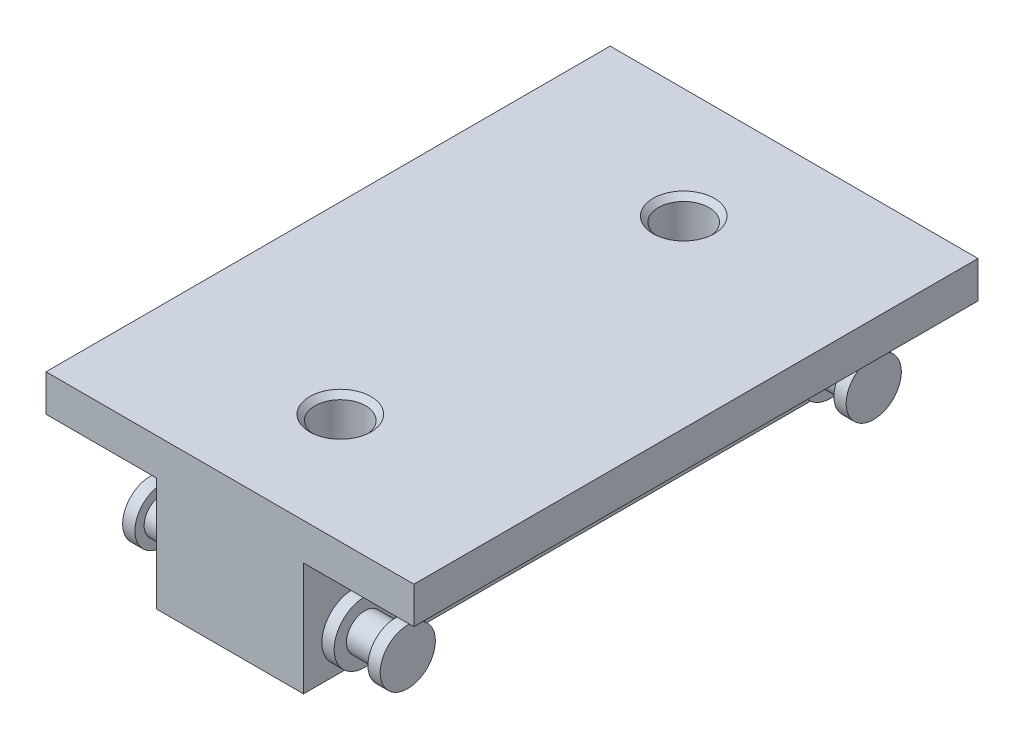
ISO-10303-21;
HEADER;
FILE_DESCRIPTION(('STEP AP214'),'2;1');
FILE_NAME('part.step','',(''),(''),'','','');
FILE_SCHEMA(('AUTOMOTIVE_DESIGN { 1 0 10303 214 1 1 1 1 }'));
ENDSEC;
DATA;
#1=APPLICATION_CONTEXT('core data for automotive mechanical design processes');
#2=APPLICATION_PROTOCOL_DEFINITION('international standard','automotive_design',2000,#1);
#3=PRODUCT_CONTEXT('',#1,'mechanical');
#4=PRODUCT('Part','Part','',(#3));
#5=PRODUCT_RELATED_PRODUCT_CATEGORY('part','',(#4));
#6=PRODUCT_DEFINITION_FORMATION('','',#4);
#7=PRODUCT_DEFINITION_CONTEXT('part definition',#1,'design');
#8=PRODUCT_DEFINITION('design','',#6,#7);
#9=PRODUCT_DEFINITION_SHAPE('','',#8);
#10=(LENGTH_UNIT() NAMED_UNIT(*) SI_UNIT(.MILLI.,.METRE.));
#11=(NAMED_UNIT(*) PLANE_ANGLE_UNIT() SI_UNIT($,.RADIAN.));
#12=(NAMED_UNIT(*) SI_UNIT($,.STERADIAN.) SOLID_ANGLE_UNIT());
#13=UNCERTAINTY_MEASURE_WITH_UNIT(LENGTH_MEASURE(1.E-05),#10,'distance_accuracy_value','');
#14=(GEOMETRIC_REPRESENTATION_CONTEXT(3) GLOBAL_UNCERTAINTY_ASSIGNED_CONTEXT((#13)) GLOBAL_UNIT_ASSIGNED_CONTEXT((#10,
#11,#12)) REPRESENTATION_CONTEXT('',''));
#15=CARTESIAN_POINT('',(0.,0.,0.));
#16=DIRECTION('',(0.,0.,1.));
#17=DIRECTION('',(1.,0.,0.));
#18=AXIS2_PLACEMENT_3D('',#15,#16,#17);
#19=CARTESIAN_POINT('',(15.,6.25,23.));
#20=DIRECTION('',(0.,-1.,0.));
#21=DIRECTION('',(0.,0.,-1.));
#22=AXIS2_PLACEMENT_3D('',#19,#20,#21);
#23=PLANE('',#22);
#24=CARTESIAN_POINT('',(0.,6.25,14.));
#25=DIRECTION('',(0.,1.,0.));
#26=DIRECTION('',(0.,0.,1.));
#27=AXIS2_PLACEMENT_3D('',#24,#25,#26);
#28=CIRCLE('',#27,2.5);
#29=CARTESIAN_POINT('',(0.,6.25,16.5));
#30=VERTEX_POINT('',#29);
#31=EDGE_CURVE('E204',#30,#30,#28,.T.);
#32=ORIENTED_EDGE('',*,*,#31,.F.);
#33=EDGE_LOOP('',(#32));
#34=FACE_BOUND('',#33,.T.);
#35=DIRECTION('',(0.,0.,-1.));
#36=VECTOR('',#35,1.);
#37=CARTESIAN_POINT('',(15.,6.25,23.));
#38=LINE('',#37,#36);
#39=CARTESIAN_POINT('',(15.,6.25,23.));
#40=VERTEX_POINT('',#39);
#41=CARTESIAN_POINT('',(15.,6.25,-23.));
#42=VERTEX_POINT('',#41);
#43=EDGE_CURVE('E123',#40,#42,#38,.T.);
#44=ORIENTED_EDGE('',*,*,#43,.T.);
#45=DIRECTION('',(-1.,0.,0.));
#46=VECTOR('',#45,1.);
#47=CARTESIAN_POINT('',(15.,6.25,-23.));
#48=LINE('',#47,#46);
#49=CARTESIAN_POINT('',(-15.,6.25,-23.));
#50=VERTEX_POINT('',#49);
#51=EDGE_CURVE('E116',#42,#50,#48,.T.);
#52=ORIENTED_EDGE('',*,*,#51,.T.);
#53=DIRECTION('',(0.,0.,-1.));
#54=VECTOR('',#53,1.);
#55=CARTESIAN_POINT('',(-15.,6.25,23.));
#56=LINE('',#55,#54);
#57=CARTESIAN_POINT('',(-15.,6.25,23.));
#58=VERTEX_POINT('',#57);
#59=EDGE_CURVE('E99',#58,#50,#56,.T.);
#60=ORIENTED_EDGE('',*,*,#59,.F.);
#61=DIRECTION('',(-1.,0.,0.));
#62=VECTOR('',#61,1.);
#63=CARTESIAN_POINT('',(15.,6.25,23.));
#64=LINE('',#63,#62);
#65=EDGE_CURVE('E146',#40,#58,#64,.T.);
#66=ORIENTED_EDGE('',*,*,#65,.F.);
#67=EDGE_LOOP('',(#44,#52,#60,#66));
#68=FACE_BOUND('',#67,.T.);
#69=CARTESIAN_POINT('',(0.,6.25,-14.));
#70=DIRECTION('',(0.,1.,0.));
#71=DIRECTION('',(0.,0.,1.));
#72=AXIS2_PLACEMENT_3D('',#69,#70,#71);
#73=CIRCLE('',#72,2.5);
#74=CARTESIAN_POINT('',(0.,6.25,-11.5));
#75=VERTEX_POINT('',#74);
#76=EDGE_CURVE('E586',#75,#75,#73,.T.);
#77=ORIENTED_EDGE('',*,*,#76,.F.);
#78=EDGE_LOOP('',(#77));
#79=FACE_BOUND('',#78,.T.);
#80=ADVANCED_FACE('F35',(#34,#68,#79),#23,.F.);
#81=CARTESIAN_POINT('',(-6.,-6.,23.));
#82=DIRECTION('',(0.,1.,0.));
#83=DIRECTION('',(0.,0.,1.));
#84=AXIS2_PLACEMENT_3D('',#81,#82,#83);
#85=PLANE('',#84);
#86=CARTESIAN_POINT('',(0.,-6.,14.));
#87=DIRECTION('',(0.,1.,0.));
#88=DIRECTION('',(0.,0.,1.));
#89=AXIS2_PLACEMENT_3D('',#86,#87,#88);
#90=CIRCLE('',#89,2.5);
#91=CARTESIAN_POINT('',(0.,-6.,16.5));
#92=VERTEX_POINT('',#91);
#93=EDGE_CURVE('E589',#92,#92,#90,.T.);
#94=ORIENTED_EDGE('',*,*,#93,.T.);
#95=EDGE_LOOP('',(#94));
#96=FACE_BOUND('',#95,.T.);
#97=DIRECTION('',(0.,0.,-1.));
#98=VECTOR('',#97,1.);
#99=CARTESIAN_POINT('',(-6.,-6.,23.));
#100=LINE('',#99,#98);
#101=CARTESIAN_POINT('',(-6.,-6.,23.));
#102=VERTEX_POINT('',#101);
#103=CARTESIAN_POINT('',(-6.,-6.,-23.));
#104=VERTEX_POINT('',#103);
#105=EDGE_CURVE('E166',#102,#104,#100,.T.);
#106=ORIENTED_EDGE('',*,*,#105,.T.);
#107=DIRECTION('',(1.,0.,0.));
#108=VECTOR('',#107,1.);
#109=CARTESIAN_POINT('',(-6.,-6.,-23.));
#110=LINE('',#109,#108);
#111=CARTESIAN_POINT('',(6.,-6.,-23.));
#112=VERTEX_POINT('',#111);
#113=EDGE_CURVE('E135',#104,#112,#110,.T.);
#114=ORIENTED_EDGE('',*,*,#113,.T.);
#115=DIRECTION('',(0.,0.,-1.));
#116=VECTOR('',#115,1.);
#117=CARTESIAN_POINT('',(6.,-6.,23.));
#118=LINE('',#117,#116);
#119=CARTESIAN_POINT('',(6.,-6.,23.));
#120=VERTEX_POINT('',#119);
#121=EDGE_CURVE('E164',#120,#112,#118,.T.);
#122=ORIENTED_EDGE('',*,*,#121,.F.);
#123=DIRECTION('',(1.,0.,0.));
#124=VECTOR('',#123,1.);
#125=CARTESIAN_POINT('',(-6.,-6.,23.));
#126=LINE('',#125,#124);
#127=EDGE_CURVE('E153',#102,#120,#126,.T.);
#128=ORIENTED_EDGE('',*,*,#127,.F.);
#129=EDGE_LOOP('',(#106,#114,#122,#128));
#130=FACE_BOUND('',#129,.T.);
#131=CARTESIAN_POINT('',(0.,-6.,-14.));
#132=DIRECTION('',(0.,1.,0.));
#133=DIRECTION('',(0.,0.,1.));
#134=AXIS2_PLACEMENT_3D('',#131,#132,#133);
#135=CIRCLE('',#134,2.5);
#136=CARTESIAN_POINT('',(0.,-6.,-11.5));
#137=VERTEX_POINT('',#136);
#138=EDGE_CURVE('E579',#137,#137,#135,.T.);
#139=ORIENTED_EDGE('',*,*,#138,.T.);
#140=EDGE_LOOP('',(#139));
#141=FACE_BOUND('',#140,.T.);
#142=ADVANCED_FACE('F190',(#96,#130,#141),#85,.F.);
#143=CARTESIAN_POINT('',(-6.,3.25,23.));
#144=DIRECTION('',(1.,0.,0.));
#145=DIRECTION('',(0.,0.,-1.));
#146=AXIS2_PLACEMENT_3D('',#143,#144,#145);
#147=PLANE('',#146);
#148=CARTESIAN_POINT('',(-6.,-3.125,19.));
#149=DIRECTION('',(1.,0.,0.));
#150=DIRECTION('',(0.,0.,-1.));
#151=AXIS2_PLACEMENT_3D('',#148,#149,#150);
#152=CIRCLE('',#151,2.5);
#153=CARTESIAN_POINT('',(-6.,-3.125,16.5));
#154=VERTEX_POINT('',#153);
#155=EDGE_CURVE('E173',#154,#154,#152,.F.);
#156=ORIENTED_EDGE('',*,*,#155,.F.);
#157=EDGE_LOOP('',(#156));
#158=FACE_BOUND('',#157,.T.);
#159=DIRECTION('',(0.,0.,-1.));
#160=VECTOR('',#159,1.);
#161=CARTESIAN_POINT('',(-6.,3.25,23.));
#162=LINE('',#161,#160);
#163=CARTESIAN_POINT('',(-6.,3.25,23.));
#164=VERTEX_POINT('',#163);
#165=CARTESIAN_POINT('',(-6.,3.25,-23.));
#166=VERTEX_POINT('',#165);
#167=EDGE_CURVE('E168',#164,#166,#162,.T.);
#168=ORIENTED_EDGE('',*,*,#167,.T.);
#169=DIRECTION('',(0.,-1.,0.));
#170=VECTOR('',#169,1.);
#171=CARTESIAN_POINT('',(-6.,3.25,-23.));
#172=LINE('',#171,#170);
#173=EDGE_CURVE('E132',#166,#104,#172,.T.);
#174=ORIENTED_EDGE('',*,*,#173,.T.);
#175=ORIENTED_EDGE('',*,*,#105,.F.);
#176=DIRECTION('',(0.,-1.,0.));
#177=VECTOR('',#176,1.);
#178=CARTESIAN_POINT('',(-6.,3.25,23.));
#179=LINE('',#178,#177);
#180=EDGE_CURVE('E151',#164,#102,#179,.T.);
#181=ORIENTED_EDGE('',*,*,#180,.F.);
#182=EDGE_LOOP('',(#168,#174,#175,#181));
#183=FACE_BOUND('',#182,.T.);
#184=CARTESIAN_POINT('',(-6.,-3.125,-19.));
#185=DIRECTION('',(1.,0.,0.));
#186=DIRECTION('',(0.,0.,-1.));
#187=AXIS2_PLACEMENT_3D('',#184,#185,#186);
#188=CIRCLE('',#187,2.5);
#189=CARTESIAN_POINT('',(-6.,-3.125,-21.5));
#190=VERTEX_POINT('',#189);
#191=EDGE_CURVE('E11',#190,#190,#188,.F.);
#192=ORIENTED_EDGE('',*,*,#191,.F.);
#193=EDGE_LOOP('',(#192));
#194=FACE_BOUND('',#193,.T.);
#195=ADVANCED_FACE('F182',(#158,#183,#194),#147,.F.);
#196=CARTESIAN_POINT('',(6.,-6.,23.));
#197=DIRECTION('',(-1.,0.,0.));
#198=DIRECTION('',(0.,0.,1.));
#199=AXIS2_PLACEMENT_3D('',#196,#197,#198);
#200=PLANE('',#199);
#201=ORIENTED_EDGE('',*,*,#121,.T.);
#202=DIRECTION('',(0.,1.,0.));
#203=VECTOR('',#202,1.);
#204=CARTESIAN_POINT('',(6.,-6.,-23.));
#205=LINE('',#204,#203);
#206=CARTESIAN_POINT('',(6.,3.25,-23.));
#207=VERTEX_POINT('',#206);
#208=EDGE_CURVE('E138',#112,#207,#205,.T.);
#209=ORIENTED_EDGE('',*,*,#208,.T.);
#210=DIRECTION('',(0.,0.,-1.));
#211=VECTOR('',#210,1.);
#212=CARTESIAN_POINT('',(6.,3.25,23.));
#213=LINE('',#212,#211);
#214=CARTESIAN_POINT('',(6.,3.25,23.));
#215=VERTEX_POINT('',#214);
#216=EDGE_CURVE('E162',#215,#207,#213,.T.);
#217=ORIENTED_EDGE('',*,*,#216,.F.);
#218=DIRECTION('',(0.,1.,0.));
#219=VECTOR('',#218,1.);
#220=CARTESIAN_POINT('',(6.,-6.,23.));
#221=LINE('',#220,#219);
#222=EDGE_CURVE('E155',#120,#215,#221,.T.);
#223=ORIENTED_EDGE('',*,*,#222,.F.);
#224=EDGE_LOOP('',(#201,#209,#217,#223));
#225=FACE_BOUND('',#224,.T.);
#226=CARTESIAN_POINT('',(6.,-3.125,19.));
#227=DIRECTION('',(-1.,0.,0.));
#228=DIRECTION('',(0.,0.,1.));
#229=AXIS2_PLACEMENT_3D('',#226,#227,#228);
#230=CIRCLE('',#229,2.5);
#231=CARTESIAN_POINT('',(6.,-3.125,21.5));
#232=VERTEX_POINT('',#231);
#233=EDGE_CURVE('E108',#232,#232,#230,.F.);
#234=ORIENTED_EDGE('',*,*,#233,.F.);
#235=EDGE_LOOP('',(#234));
#236=FACE_BOUND('',#235,.T.);
#237=CARTESIAN_POINT('',(6.,-3.125,-19.));
#238=DIRECTION('',(-1.,0.,0.));
#239=DIRECTION('',(0.,0.,1.));
#240=AXIS2_PLACEMENT_3D('',#237,#238,#239);
#241=CIRCLE('',#240,2.5);
#242=CARTESIAN_POINT('',(6.,-3.125,-16.5));
#243=VERTEX_POINT('',#242);
#244=EDGE_CURVE('E42',#243,#243,#241,.F.);
#245=ORIENTED_EDGE('',*,*,#244,.F.);
#246=EDGE_LOOP('',(#245));
#247=FACE_BOUND('',#246,.T.);
#248=ADVANCED_FACE('F180',(#225,#236,#247),#200,.F.);
#249=CARTESIAN_POINT('',(-15.,6.25,23.));
#250=DIRECTION('',(1.,0.,0.));
#251=DIRECTION('',(0.,0.,-1.));
#252=AXIS2_PLACEMENT_3D('',#249,#250,#251);
#253=PLANE('',#252);
#254=ORIENTED_EDGE('',*,*,#59,.T.);
#255=DIRECTION('',(0.,-1.,0.));
#256=VECTOR('',#255,1.);
#257=CARTESIAN_POINT('',(-15.,6.25,-23.));
#258=LINE('',#257,#256);
#259=CARTESIAN_POINT('',(-15.,3.25,-23.));
#260=VERTEX_POINT('',#259);
#261=EDGE_CURVE('E103',#50,#260,#258,.T.);
#262=ORIENTED_EDGE('',*,*,#261,.T.);
#263=DIRECTION('',(0.,0.,-1.));
#264=VECTOR('',#263,1.);
#265=CARTESIAN_POINT('',(-15.,3.25,23.));
#266=LINE('',#265,#264);
#267=CARTESIAN_POINT('',(-15.,3.25,23.));
#268=VERTEX_POINT('',#267);
#269=EDGE_CURVE('E109',#268,#260,#266,.T.);
#270=ORIENTED_EDGE('',*,*,#269,.F.);
#271=DIRECTION('',(0.,-1.,0.));
#272=VECTOR('',#271,1.);
#273=CARTESIAN_POINT('',(-15.,6.25,23.));
#274=LINE('',#273,#272);
#275=EDGE_CURVE('E104',#58,#268,#274,.T.);
#276=ORIENTED_EDGE('',*,*,#275,.F.);
#277=EDGE_LOOP('',(#254,#262,#270,#276));
#278=FACE_BOUND('',#277,.T.);
#279=ADVANCED_FACE('F101',(#278),#253,.F.);
#280=CARTESIAN_POINT('',(-15.,3.25,23.));
#281=DIRECTION('',(0.,1.,0.));
#282=DIRECTION('',(0.,0.,1.));
#283=AXIS2_PLACEMENT_3D('',#280,#281,#282);
#284=PLANE('',#283);
#285=ORIENTED_EDGE('',*,*,#269,.T.);
#286=DIRECTION('',(1.,0.,0.));
#287=VECTOR('',#286,1.);
#288=CARTESIAN_POINT('',(-15.,3.25,-23.));
#289=LINE('',#288,#287);
#290=EDGE_CURVE('E120',#260,#166,#289,.T.);
#291=ORIENTED_EDGE('',*,*,#290,.T.);
#292=ORIENTED_EDGE('',*,*,#167,.F.);
#293=DIRECTION('',(1.,0.,0.));
#294=VECTOR('',#293,1.);
#295=CARTESIAN_POINT('',(-15.,3.25,23.));
#296=LINE('',#295,#294);
#297=EDGE_CURVE('E149',#268,#164,#296,.T.);
#298=ORIENTED_EDGE('',*,*,#297,.F.);
#299=EDGE_LOOP('',(#285,#291,#292,#298));
#300=FACE_BOUND('',#299,.T.);
#301=ADVANCED_FACE('F189',(#300),#284,.F.);
#302=CARTESIAN_POINT('',(6.,3.25,23.));
#303=DIRECTION('',(0.,1.,0.));
#304=DIRECTION('',(0.,0.,1.));
#305=AXIS2_PLACEMENT_3D('',#302,#303,#304);
#306=PLANE('',#305);
#307=ORIENTED_EDGE('',*,*,#216,.T.);
#308=DIRECTION('',(1.,0.,0.));
#309=VECTOR('',#308,1.);
#310=CARTESIAN_POINT('',(6.,3.25,-23.));
#311=LINE('',#310,#309);
#312=CARTESIAN_POINT('',(15.,3.25,-23.));
#313=VERTEX_POINT('',#312);
#314=EDGE_CURVE('E141',#207,#313,#311,.T.);
#315=ORIENTED_EDGE('',*,*,#314,.T.);
#316=DIRECTION('',(0.,0.,-1.));
#317=VECTOR('',#316,1.);
#318=CARTESIAN_POINT('',(15.,3.25,23.));
#319=LINE('',#318,#317);
#320=CARTESIAN_POINT('',(15.,3.25,23.));
#321=VERTEX_POINT('',#320);
#322=EDGE_CURVE('E160',#321,#313,#319,.T.);
#323=ORIENTED_EDGE('',*,*,#322,.F.);
#324=DIRECTION('',(1.,0.,0.));
#325=VECTOR('',#324,1.);
#326=CARTESIAN_POINT('',(6.,3.25,23.));
#327=LINE('',#326,#325);
#328=EDGE_CURVE('E54',#215,#321,#327,.T.);
#329=ORIENTED_EDGE('',*,*,#328,.F.);
#330=EDGE_LOOP('',(#307,#315,#323,#329));
#331=FACE_BOUND('',#330,.T.);
#332=ADVANCED_FACE('F317',(#331),#306,.F.);
#333=CARTESIAN_POINT('',(15.,3.25,23.));
#334=DIRECTION('',(-1.,0.,0.));
#335=DIRECTION('',(0.,0.,1.));
#336=AXIS2_PLACEMENT_3D('',#333,#334,#335);
#337=PLANE('',#336);
#338=ORIENTED_EDGE('',*,*,#322,.T.);
#339=DIRECTION('',(0.,1.,0.));
#340=VECTOR('',#339,1.);
#341=CARTESIAN_POINT('',(15.,3.25,-23.));
#342=LINE('',#341,#340);
#343=EDGE_CURVE('E144',#313,#42,#342,.T.);
#344=ORIENTED_EDGE('',*,*,#343,.T.);
#345=ORIENTED_EDGE('',*,*,#43,.F.);
#346=DIRECTION('',(0.,1.,0.));
#347=VECTOR('',#346,1.);
#348=CARTESIAN_POINT('',(15.,3.25,23.));
#349=LINE('',#348,#347);
#350=EDGE_CURVE('E49',#321,#40,#349,.T.);
#351=ORIENTED_EDGE('',*,*,#350,.F.);
#352=EDGE_LOOP('',(#338,#344,#345,#351));
#353=FACE_BOUND('',#352,.T.);
#354=ADVANCED_FACE('F315',(#353),#337,.F.);
#355=CARTESIAN_POINT('',(0.,0.,23.));
#356=DIRECTION('',(0.,0.,1.));
#357=DIRECTION('',(1.,0.,0.));
#358=AXIS2_PLACEMENT_3D('',#355,#356,#357);
#359=PLANE('',#358);
#360=ORIENTED_EDGE('',*,*,#65,.T.);
#361=ORIENTED_EDGE('',*,*,#275,.T.);
#362=ORIENTED_EDGE('',*,*,#297,.T.);
#363=ORIENTED_EDGE('',*,*,#180,.T.);
#364=ORIENTED_EDGE('',*,*,#127,.T.);
#365=ORIENTED_EDGE('',*,*,#222,.T.);
#366=ORIENTED_EDGE('',*,*,#328,.T.);
#367=ORIENTED_EDGE('',*,*,#350,.T.);
#368=EDGE_LOOP('',(#360,#361,#362,#363,#364,#365,#366,#367));
#369=FACE_BOUND('',#368,.T.);
#370=ADVANCED_FACE('F312',(#369),#359,.T.);
#371=CARTESIAN_POINT('',(0.,0.,-23.));
#372=DIRECTION('',(0.,0.,1.));
#373=DIRECTION('',(1.,0.,0.));
#374=AXIS2_PLACEMENT_3D('',#371,#372,#373);
#375=PLANE('',#374);
#376=ORIENTED_EDGE('',*,*,#51,.F.);
#377=ORIENTED_EDGE('',*,*,#343,.F.);
#378=ORIENTED_EDGE('',*,*,#314,.F.);
#379=ORIENTED_EDGE('',*,*,#208,.F.);
#380=ORIENTED_EDGE('',*,*,#113,.F.);
#381=ORIENTED_EDGE('',*,*,#173,.F.);
#382=ORIENTED_EDGE('',*,*,#290,.F.);
#383=ORIENTED_EDGE('',*,*,#261,.F.);
#384=EDGE_LOOP('',(#376,#377,#378,#379,#380,#381,#382,#383));
#385=FACE_BOUND('',#384,.T.);
#386=ADVANCED_FACE('F114',(#385),#375,.F.);
#387=CARTESIAN_POINT('',(10.5,-3.125,19.));
#388=DIRECTION('',(-1.,0.,0.));
#389=DIRECTION('',(0.,0.,1.));
#390=AXIS2_PLACEMENT_3D('',#387,#388,#389);
#391=PLANE('',#390);
#392=CARTESIAN_POINT('',(10.5,-3.125,19.));
#393=DIRECTION('',(1.,0.,0.));
#394=DIRECTION('',(0.,0.,-1.));
#395=AXIS2_PLACEMENT_3D('',#392,#393,#394);
#396=CIRCLE('',#395,2.25);
#397=CARTESIAN_POINT('',(10.5,-3.125,16.75));
#398=VERTEX_POINT('',#397);
#399=EDGE_CURVE('E124',#398,#398,#396,.T.);
#400=ORIENTED_EDGE('',*,*,#399,.T.);
#401=EDGE_LOOP('',(#400));
#402=FACE_BOUND('',#401,.T.);
#403=ADVANCED_FACE('F305',(#402),#391,.F.);
#404=CARTESIAN_POINT('',(-10.5,-3.125,19.));
#405=DIRECTION('',(1.,0.,0.));
#406=DIRECTION('',(0.,0.,-1.));
#407=AXIS2_PLACEMENT_3D('',#404,#405,#406);
#408=CYLINDRICAL_SURFACE('',#407,2.25);
#409=ORIENTED_EDGE('',*,*,#399,.F.);
#410=EDGE_LOOP('',(#409));
#411=FACE_BOUND('',#410,.T.);
#412=CARTESIAN_POINT('',(9.5,-3.125,19.));
#413=DIRECTION('',(1.,0.,0.));
#414=DIRECTION('',(0.,0.,-1.));
#415=AXIS2_PLACEMENT_3D('',#412,#413,#414);
#416=CIRCLE('',#415,2.25);
#417=CARTESIAN_POINT('',(9.5,-3.125,16.75));
#418=VERTEX_POINT('',#417);
#419=EDGE_CURVE('E127',#418,#418,#416,.T.);
#420=ORIENTED_EDGE('',*,*,#419,.T.);
#421=EDGE_LOOP('',(#420));
#422=FACE_BOUND('',#421,.T.);
#423=ADVANCED_FACE('F269',(#411,#422),#408,.T.);
#424=CARTESIAN_POINT('',(9.5,-5.375,19.));
#425=DIRECTION('',(1.,0.,0.));
#426=DIRECTION('',(0.,0.,-1.));
#427=AXIS2_PLACEMENT_3D('',#424,#425,#426);
#428=PLANE('',#427);
#429=ORIENTED_EDGE('',*,*,#419,.F.);
#430=EDGE_LOOP('',(#429));
#431=FACE_BOUND('',#430,.T.);
#432=CARTESIAN_POINT('',(9.5,-3.125,19.));
#433=DIRECTION('',(1.,0.,0.));
#434=DIRECTION('',(0.,0.,-1.));
#435=AXIS2_PLACEMENT_3D('',#432,#433,#434);
#436=CIRCLE('',#435,1.5);
#437=CARTESIAN_POINT('',(9.5,-3.125,17.5));
#438=VERTEX_POINT('',#437);
#439=EDGE_CURVE('E264',#438,#438,#436,.T.);
#440=ORIENTED_EDGE('',*,*,#439,.T.);
#441=EDGE_LOOP('',(#440));
#442=FACE_BOUND('',#441,.T.);
#443=ADVANCED_FACE('F271',(#431,#442),#428,.F.);
#444=CARTESIAN_POINT('',(-10.5,-3.125,19.));
#445=DIRECTION('',(1.,0.,0.));
#446=DIRECTION('',(0.,0.,-1.));
#447=AXIS2_PLACEMENT_3D('',#444,#445,#446);
#448=CYLINDRICAL_SURFACE('',#447,1.5);
#449=ORIENTED_EDGE('',*,*,#439,.F.);
#450=EDGE_LOOP('',(#449));
#451=FACE_BOUND('',#450,.T.);
#452=CARTESIAN_POINT('',(7.,-3.125,19.));
#453=DIRECTION('',(1.,0.,0.));
#454=DIRECTION('',(0.,0.,-1.));
#455=AXIS2_PLACEMENT_3D('',#452,#453,#454);
#456=CIRCLE('',#455,1.5);
#457=CARTESIAN_POINT('',(7.,-3.125,17.5));
#458=VERTEX_POINT('',#457);
#459=EDGE_CURVE('E261',#458,#458,#456,.T.);
#460=ORIENTED_EDGE('',*,*,#459,.T.);
#461=EDGE_LOOP('',(#460));
#462=FACE_BOUND('',#461,.T.);
#463=ADVANCED_FACE('F274',(#451,#462),#448,.T.);
#464=CARTESIAN_POINT('',(7.,-4.625,19.));
#465=DIRECTION('',(-1.,0.,0.));
#466=DIRECTION('',(0.,0.,1.));
#467=AXIS2_PLACEMENT_3D('',#464,#465,#466);
#468=PLANE('',#467);
#469=ORIENTED_EDGE('',*,*,#459,.F.);
#470=EDGE_LOOP('',(#469));
#471=FACE_BOUND('',#470,.T.);
#472=CARTESIAN_POINT('',(7.,-3.125,19.));
#473=DIRECTION('',(1.,0.,0.));
#474=DIRECTION('',(0.,0.,-1.));
#475=AXIS2_PLACEMENT_3D('',#472,#473,#474);
#476=CIRCLE('',#475,2.5);
#477=CARTESIAN_POINT('',(7.,-3.125,16.5));
#478=VERTEX_POINT('',#477);
#479=EDGE_CURVE('E258',#478,#478,#476,.T.);
#480=ORIENTED_EDGE('',*,*,#479,.T.);
#481=EDGE_LOOP('',(#480));
#482=FACE_BOUND('',#481,.T.);
#483=ADVANCED_FACE('F280',(#471,#482),#468,.F.);
#484=CARTESIAN_POINT('',(-10.5,-3.125,19.));
#485=DIRECTION('',(1.,0.,0.));
#486=DIRECTION('',(0.,0.,-1.));
#487=AXIS2_PLACEMENT_3D('',#484,#485,#486);
#488=CYLINDRICAL_SURFACE('',#487,2.5);
#489=ORIENTED_EDGE('',*,*,#479,.F.);
#490=EDGE_LOOP('',(#489));
#491=FACE_BOUND('',#490,.T.);
#492=ORIENTED_EDGE('',*,*,#233,.T.);
#493=EDGE_LOOP('',(#492));
#494=FACE_BOUND('',#493,.T.);
#495=ADVANCED_FACE('F286',(#491,#494),#488,.T.);
#496=CARTESIAN_POINT('',(-10.5,-3.125,19.));
#497=DIRECTION('',(1.,0.,0.));
#498=DIRECTION('',(0.,0.,-1.));
#499=AXIS2_PLACEMENT_3D('',#496,#497,#498);
#500=CYLINDRICAL_SURFACE('',#499,2.5);
#501=ORIENTED_EDGE('',*,*,#155,.T.);
#502=EDGE_LOOP('',(#501));
#503=FACE_BOUND('',#502,.T.);
#504=CARTESIAN_POINT('',(-7.,-3.125,19.));
#505=DIRECTION('',(1.,0.,0.));
#506=DIRECTION('',(0.,0.,-1.));
#507=AXIS2_PLACEMENT_3D('',#504,#505,#506);
#508=CIRCLE('',#507,2.5);
#509=CARTESIAN_POINT('',(-7.,-3.125,16.5));
#510=VERTEX_POINT('',#509);
#511=EDGE_CURVE('E255',#510,#510,#508,.T.);
#512=ORIENTED_EDGE('',*,*,#511,.T.);
#513=EDGE_LOOP('',(#512));
#514=FACE_BOUND('',#513,.T.);
#515=ADVANCED_FACE('F292',(#503,#514),#500,.T.);
#516=CARTESIAN_POINT('',(-7.,-5.625,19.));
#517=DIRECTION('',(1.,0.,0.));
#518=DIRECTION('',(0.,0.,-1.));
#519=AXIS2_PLACEMENT_3D('',#516,#517,#518);
#520=PLANE('',#519);
#521=ORIENTED_EDGE('',*,*,#511,.F.);
#522=EDGE_LOOP('',(#521));
#523=FACE_BOUND('',#522,.T.);
#524=CARTESIAN_POINT('',(-7.,-3.125,19.));
#525=DIRECTION('',(1.,0.,0.));
#526=DIRECTION('',(0.,0.,-1.));
#527=AXIS2_PLACEMENT_3D('',#524,#525,#526);
#528=CIRCLE('',#527,1.5);
#529=CARTESIAN_POINT('',(-7.,-3.125,17.5));
#530=VERTEX_POINT('',#529);
#531=EDGE_CURVE('E252',#530,#530,#528,.T.);
#532=ORIENTED_EDGE('',*,*,#531,.T.);
#533=EDGE_LOOP('',(#532));
#534=FACE_BOUND('',#533,.T.);
#535=ADVANCED_FACE('F298',(#523,#534),#520,.F.);
#536=CARTESIAN_POINT('',(-10.5,-3.125,19.));
#537=DIRECTION('',(1.,0.,0.));
#538=DIRECTION('',(0.,0.,-1.));
#539=AXIS2_PLACEMENT_3D('',#536,#537,#538);
#540=CYLINDRICAL_SURFACE('',#539,1.5);
#541=ORIENTED_EDGE('',*,*,#531,.F.);
#542=EDGE_LOOP('',(#541));
#543=FACE_BOUND('',#542,.T.);
#544=CARTESIAN_POINT('',(-9.5,-3.125,19.));
#545=DIRECTION('',(1.,0.,0.));
#546=DIRECTION('',(0.,0.,-1.));
#547=AXIS2_PLACEMENT_3D('',#544,#545,#546);
#548=CIRCLE('',#547,1.5);
#549=CARTESIAN_POINT('',(-9.5,-3.125,17.5));
#550=VERTEX_POINT('',#549);
#551=EDGE_CURVE('E249',#550,#550,#548,.T.);
#552=ORIENTED_EDGE('',*,*,#551,.T.);
#553=EDGE_LOOP('',(#552));
#554=FACE_BOUND('',#553,.T.);
#555=ADVANCED_FACE('F418',(#543,#554),#540,.T.);
#556=CARTESIAN_POINT('',(-9.5,-4.625,19.));
#557=DIRECTION('',(-1.,0.,0.));
#558=DIRECTION('',(0.,0.,1.));
#559=AXIS2_PLACEMENT_3D('',#556,#557,#558);
#560=PLANE('',#559);
#561=ORIENTED_EDGE('',*,*,#551,.F.);
#562=EDGE_LOOP('',(#561));
#563=FACE_BOUND('',#562,.T.);
#564=CARTESIAN_POINT('',(-9.5,-3.125,19.));
#565=DIRECTION('',(1.,0.,0.));
#566=DIRECTION('',(0.,0.,-1.));
#567=AXIS2_PLACEMENT_3D('',#564,#565,#566);
#568=CIRCLE('',#567,2.25);
#569=CARTESIAN_POINT('',(-9.5,-3.125,16.75));
#570=VERTEX_POINT('',#569);
#571=EDGE_CURVE('E246',#570,#570,#568,.T.);
#572=ORIENTED_EDGE('',*,*,#571,.T.);
#573=EDGE_LOOP('',(#572));
#574=FACE_BOUND('',#573,.T.);
#575=ADVANCED_FACE('F414',(#563,#574),#560,.F.);
#576=CARTESIAN_POINT('',(-10.5,-3.125,19.));
#577=DIRECTION('',(1.,0.,0.));
#578=DIRECTION('',(0.,0.,-1.));
#579=AXIS2_PLACEMENT_3D('',#576,#577,#578);
#580=CYLINDRICAL_SURFACE('',#579,2.25);
#581=ORIENTED_EDGE('',*,*,#571,.F.);
#582=EDGE_LOOP('',(#581));
#583=FACE_BOUND('',#582,.T.);
#584=CARTESIAN_POINT('',(-10.5,-3.125,19.));
#585=DIRECTION('',(1.,0.,0.));
#586=DIRECTION('',(0.,0.,-1.));
#587=AXIS2_PLACEMENT_3D('',#584,#585,#586);
#588=CIRCLE('',#587,2.25);
#589=CARTESIAN_POINT('',(-10.5,-3.125,16.75));
#590=VERTEX_POINT('',#589);
#591=EDGE_CURVE('E243',#590,#590,#588,.T.);
#592=ORIENTED_EDGE('',*,*,#591,.T.);
#593=EDGE_LOOP('',(#592));
#594=FACE_BOUND('',#593,.T.);
#595=ADVANCED_FACE('F410',(#583,#594),#580,.T.);
#596=CARTESIAN_POINT('',(-10.5,-5.375,19.));
#597=DIRECTION('',(1.,0.,0.));
#598=DIRECTION('',(0.,0.,-1.));
#599=AXIS2_PLACEMENT_3D('',#596,#597,#598);
#600=PLANE('',#599);
#601=ORIENTED_EDGE('',*,*,#591,.F.);
#602=EDGE_LOOP('',(#601));
#603=FACE_BOUND('',#602,.T.);
#604=ADVANCED_FACE('F406',(#603),#600,.F.);
#605=CARTESIAN_POINT('',(10.5,-3.125,-19.));
#606=DIRECTION('',(-1.,0.,0.));
#607=DIRECTION('',(0.,0.,1.));
#608=AXIS2_PLACEMENT_3D('',#605,#606,#607);
#609=PLANE('',#608);
#610=CARTESIAN_POINT('',(10.5,-3.125,-19.));
#611=DIRECTION('',(1.,0.,0.));
#612=DIRECTION('',(0.,0.,-1.));
#613=AXIS2_PLACEMENT_3D('',#610,#611,#612);
#614=CIRCLE('',#613,2.25);
#615=CARTESIAN_POINT('',(10.5,-3.125,-21.25));
#616=VERTEX_POINT('',#615);
#617=EDGE_CURVE('E240',#616,#616,#614,.T.);
#618=ORIENTED_EDGE('',*,*,#617,.T.);
#619=EDGE_LOOP('',(#618));
#620=FACE_BOUND('',#619,.T.);
#621=ADVANCED_FACE('F402',(#620),#609,.F.);
#622=CARTESIAN_POINT('',(-10.5,-3.125,-19.));
#623=DIRECTION('',(1.,0.,0.));
#624=DIRECTION('',(0.,0.,-1.));
#625=AXIS2_PLACEMENT_3D('',#622,#623,#624);
#626=CYLINDRICAL_SURFACE('',#625,2.25);
#627=ORIENTED_EDGE('',*,*,#617,.F.);
#628=EDGE_LOOP('',(#627));
#629=FACE_BOUND('',#628,.T.);
#630=CARTESIAN_POINT('',(9.5,-3.125,-19.));
#631=DIRECTION('',(1.,0.,0.));
#632=DIRECTION('',(0.,0.,-1.));
#633=AXIS2_PLACEMENT_3D('',#630,#631,#632);
#634=CIRCLE('',#633,2.25);
#635=CARTESIAN_POINT('',(9.5,-3.125,-21.25));
#636=VERTEX_POINT('',#635);
#637=EDGE_CURVE('E237',#636,#636,#634,.T.);
#638=ORIENTED_EDGE('',*,*,#637,.T.);
#639=EDGE_LOOP('',(#638));
#640=FACE_BOUND('',#639,.T.);
#641=ADVANCED_FACE('F398',(#629,#640),#626,.T.);
#642=CARTESIAN_POINT('',(9.5,-5.375,-19.));
#643=DIRECTION('',(1.,0.,0.));
#644=DIRECTION('',(0.,0.,-1.));
#645=AXIS2_PLACEMENT_3D('',#642,#643,#644);
#646=PLANE('',#645);
#647=ORIENTED_EDGE('',*,*,#637,.F.);
#648=EDGE_LOOP('',(#647));
#649=FACE_BOUND('',#648,.T.);
#650=CARTESIAN_POINT('',(9.5,-3.125,-19.));
#651=DIRECTION('',(1.,0.,0.));
#652=DIRECTION('',(0.,0.,-1.));
#653=AXIS2_PLACEMENT_3D('',#650,#651,#652);
#654=CIRCLE('',#653,1.5);
#655=CARTESIAN_POINT('',(9.5,-3.125,-20.5));
#656=VERTEX_POINT('',#655);
#657=EDGE_CURVE('E234',#656,#656,#654,.T.);
#658=ORIENTED_EDGE('',*,*,#657,.T.);
#659=EDGE_LOOP('',(#658));
#660=FACE_BOUND('',#659,.T.);
#661=ADVANCED_FACE('F394',(#649,#660),#646,.F.);
#662=CARTESIAN_POINT('',(-10.5,-3.125,-19.));
#663=DIRECTION('',(1.,0.,0.));
#664=DIRECTION('',(0.,0.,-1.));
#665=AXIS2_PLACEMENT_3D('',#662,#663,#664);
#666=CYLINDRICAL_SURFACE('',#665,1.5);
#667=ORIENTED_EDGE('',*,*,#657,.F.);
#668=EDGE_LOOP('',(#667));
#669=FACE_BOUND('',#668,.T.);
#670=CARTESIAN_POINT('',(7.,-3.125,-19.));
#671=DIRECTION('',(1.,0.,0.));
#672=DIRECTION('',(0.,0.,-1.));
#673=AXIS2_PLACEMENT_3D('',#670,#671,#672);
#674=CIRCLE('',#673,1.5);
#675=CARTESIAN_POINT('',(7.,-3.125,-20.5));
#676=VERTEX_POINT('',#675);
#677=EDGE_CURVE('E231',#676,#676,#674,.T.);
#678=ORIENTED_EDGE('',*,*,#677,.T.);
#679=EDGE_LOOP('',(#678));
#680=FACE_BOUND('',#679,.T.);
#681=ADVANCED_FACE('F390',(#669,#680),#666,.T.);
#682=CARTESIAN_POINT('',(7.,-4.625,-19.));
#683=DIRECTION('',(-1.,0.,0.));
#684=DIRECTION('',(0.,0.,1.));
#685=AXIS2_PLACEMENT_3D('',#682,#683,#684);
#686=PLANE('',#685);
#687=ORIENTED_EDGE('',*,*,#677,.F.);
#688=EDGE_LOOP('',(#687));
#689=FACE_BOUND('',#688,.T.);
#690=CARTESIAN_POINT('',(7.,-3.125,-19.));
#691=DIRECTION('',(1.,0.,0.));
#692=DIRECTION('',(0.,0.,-1.));
#693=AXIS2_PLACEMENT_3D('',#690,#691,#692);
#694=CIRCLE('',#693,2.5);
#695=CARTESIAN_POINT('',(7.,-3.125,-21.5));
#696=VERTEX_POINT('',#695);
#697=EDGE_CURVE('E228',#696,#696,#694,.T.);
#698=ORIENTED_EDGE('',*,*,#697,.T.);
#699=EDGE_LOOP('',(#698));
#700=FACE_BOUND('',#699,.T.);
#701=ADVANCED_FACE('F386',(#689,#700),#686,.F.);
#702=CARTESIAN_POINT('',(-10.5,-3.125,-19.));
#703=DIRECTION('',(1.,0.,0.));
#704=DIRECTION('',(0.,0.,-1.));
#705=AXIS2_PLACEMENT_3D('',#702,#703,#704);
#706=CYLINDRICAL_SURFACE('',#705,2.5);
#707=ORIENTED_EDGE('',*,*,#697,.F.);
#708=EDGE_LOOP('',(#707));
#709=FACE_BOUND('',#708,.T.);
#710=ORIENTED_EDGE('',*,*,#244,.T.);
#711=EDGE_LOOP('',(#710));
#712=FACE_BOUND('',#711,.T.);
#713=ADVANCED_FACE('F178',(#709,#712),#706,.T.);
#714=CARTESIAN_POINT('',(-10.5,-3.125,-19.));
#715=DIRECTION('',(1.,0.,0.));
#716=DIRECTION('',(0.,0.,-1.));
#717=AXIS2_PLACEMENT_3D('',#714,#715,#716);
#718=CYLINDRICAL_SURFACE('',#717,2.5);
#719=ORIENTED_EDGE('',*,*,#191,.T.);
#720=EDGE_LOOP('',(#719));
#721=FACE_BOUND('',#720,.T.);
#722=CARTESIAN_POINT('',(-7.,-3.125,-19.));
#723=DIRECTION('',(1.,0.,0.));
#724=DIRECTION('',(0.,0.,-1.));
#725=AXIS2_PLACEMENT_3D('',#722,#723,#724);
#726=CIRCLE('',#725,2.5);
#727=CARTESIAN_POINT('',(-7.,-3.125,-21.5));
#728=VERTEX_POINT('',#727);
#729=EDGE_CURVE('E225',#728,#728,#726,.T.);
#730=ORIENTED_EDGE('',*,*,#729,.T.);
#731=EDGE_LOOP('',(#730));
#732=FACE_BOUND('',#731,.T.);
#733=ADVANCED_FACE('F343',(#721,#732),#718,.T.);
#734=CARTESIAN_POINT('',(-7.,-5.625,-19.));
#735=DIRECTION('',(1.,0.,0.));
#736=DIRECTION('',(0.,0.,-1.));
#737=AXIS2_PLACEMENT_3D('',#734,#735,#736);
#738=PLANE('',#737);
#739=ORIENTED_EDGE('',*,*,#729,.F.);
#740=EDGE_LOOP('',(#739));
#741=FACE_BOUND('',#740,.T.);
#742=CARTESIAN_POINT('',(-7.,-3.125,-19.));
#743=DIRECTION('',(1.,0.,0.));
#744=DIRECTION('',(0.,0.,-1.));
#745=AXIS2_PLACEMENT_3D('',#742,#743,#744);
#746=CIRCLE('',#745,1.5);
#747=CARTESIAN_POINT('',(-7.,-3.125,-20.5));
#748=VERTEX_POINT('',#747);
#749=EDGE_CURVE('E222',#748,#748,#746,.T.);
#750=ORIENTED_EDGE('',*,*,#749,.T.);
#751=EDGE_LOOP('',(#750));
#752=FACE_BOUND('',#751,.T.);
#753=ADVANCED_FACE('F346',(#741,#752),#738,.F.);
#754=CARTESIAN_POINT('',(-10.5,-3.125,-19.));
#755=DIRECTION('',(1.,0.,0.));
#756=DIRECTION('',(0.,0.,-1.));
#757=AXIS2_PLACEMENT_3D('',#754,#755,#756);
#758=CYLINDRICAL_SURFACE('',#757,1.5);
#759=ORIENTED_EDGE('',*,*,#749,.F.);
#760=EDGE_LOOP('',(#759));
#761=FACE_BOUND('',#760,.T.);
#762=CARTESIAN_POINT('',(-9.5,-3.125,-19.));
#763=DIRECTION('',(1.,0.,0.));
#764=DIRECTION('',(0.,0.,-1.));
#765=AXIS2_PLACEMENT_3D('',#762,#763,#764);
#766=CIRCLE('',#765,1.5);
#767=CARTESIAN_POINT('',(-9.5,-3.125,-20.5));
#768=VERTEX_POINT('',#767);
#769=EDGE_CURVE('E219',#768,#768,#766,.T.);
#770=ORIENTED_EDGE('',*,*,#769,.T.);
#771=EDGE_LOOP('',(#770));
#772=FACE_BOUND('',#771,.T.);
#773=ADVANCED_FACE('F352',(#761,#772),#758,.T.);
#774=CARTESIAN_POINT('',(-9.5,-4.625,-19.));
#775=DIRECTION('',(-1.,0.,0.));
#776=DIRECTION('',(0.,0.,1.));
#777=AXIS2_PLACEMENT_3D('',#774,#775,#776);
#778=PLANE('',#777);
#779=ORIENTED_EDGE('',*,*,#769,.F.);
#780=EDGE_LOOP('',(#779));
#781=FACE_BOUND('',#780,.T.);
#782=CARTESIAN_POINT('',(-9.5,-3.125,-19.));
#783=DIRECTION('',(1.,0.,0.));
#784=DIRECTION('',(0.,0.,-1.));
#785=AXIS2_PLACEMENT_3D('',#782,#783,#784);
#786=CIRCLE('',#785,2.25);
#787=CARTESIAN_POINT('',(-9.5,-3.125,-21.25));
#788=VERTEX_POINT('',#787);
#789=EDGE_CURVE('E210',#788,#788,#786,.T.);
#790=ORIENTED_EDGE('',*,*,#789,.T.);
#791=EDGE_LOOP('',(#790));
#792=FACE_BOUND('',#791,.T.);
#793=ADVANCED_FACE('F358',(#781,#792),#778,.F.);
#794=CARTESIAN_POINT('',(-10.5,-3.125,-19.));
#795=DIRECTION('',(1.,0.,0.));
#796=DIRECTION('',(0.,0.,-1.));
#797=AXIS2_PLACEMENT_3D('',#794,#795,#796);
#798=CYLINDRICAL_SURFACE('',#797,2.25);
#799=ORIENTED_EDGE('',*,*,#789,.F.);
#800=EDGE_LOOP('',(#799));
#801=FACE_BOUND('',#800,.T.);
#802=CARTESIAN_POINT('',(-10.5,-3.125,-19.));
#803=DIRECTION('',(1.,0.,0.));
#804=DIRECTION('',(0.,0.,-1.));
#805=AXIS2_PLACEMENT_3D('',#802,#803,#804);
#806=CIRCLE('',#805,2.25);
#807=CARTESIAN_POINT('',(-10.5,-3.125,-21.25));
#808=VERTEX_POINT('',#807);
#809=EDGE_CURVE('E206',#808,#808,#806,.T.);
#810=ORIENTED_EDGE('',*,*,#809,.T.);
#811=EDGE_LOOP('',(#810));
#812=FACE_BOUND('',#811,.T.);
#813=ADVANCED_FACE('F364',(#801,#812),#798,.T.);
#814=CARTESIAN_POINT('',(-10.5,-5.375,-19.));
#815=DIRECTION('',(1.,0.,0.));
#816=DIRECTION('',(0.,0.,-1.));
#817=AXIS2_PLACEMENT_3D('',#814,#815,#816);
#818=PLANE('',#817);
#819=ORIENTED_EDGE('',*,*,#809,.F.);
#820=EDGE_LOOP('',(#819));
#821=FACE_BOUND('',#820,.T.);
#822=ADVANCED_FACE('F370',(#821),#818,.F.);
#823=CARTESIAN_POINT('',(0.,5.817,14.));
#824=DIRECTION('',(0.,1.,0.));
#825=DIRECTION('',(0.,0.,1.));
#826=AXIS2_PLACEMENT_3D('',#823,#824,#825);
#827=CONICAL_SURFACE('',#826,2.067,0.785398163397448);
#828=ORIENTED_EDGE('',*,*,#31,.T.);
#829=EDGE_LOOP('',(#828));
#830=FACE_BOUND('',#829,.T.);
#831=CARTESIAN_POINT('',(0.,5.817,14.));
#832=DIRECTION('',(0.,1.,0.));
#833=DIRECTION('',(0.,0.,1.));
#834=AXIS2_PLACEMENT_3D('',#831,#832,#833);
#835=CIRCLE('',#834,2.067);
#836=CARTESIAN_POINT('',(0.,5.817,16.067));
#837=VERTEX_POINT('',#836);
#838=EDGE_CURVE('E207',#837,#837,#835,.T.);
#839=ORIENTED_EDGE('',*,*,#838,.F.);
#840=EDGE_LOOP('',(#839));
#841=FACE_BOUND('',#840,.T.);
#842=ADVANCED_FACE('F375',(#830,#841),#827,.F.);
#843=CARTESIAN_POINT('',(0.,-6.,14.));
#844=DIRECTION('',(0.,1.,0.));
#845=DIRECTION('',(0.,0.,1.));
#846=AXIS2_PLACEMENT_3D('',#843,#844,#845);
#847=CYLINDRICAL_SURFACE('',#846,2.067);
#848=ORIENTED_EDGE('',*,*,#838,.T.);
#849=EDGE_LOOP('',(#848));
#850=FACE_BOUND('',#849,.T.);
#851=CARTESIAN_POINT('',(0.,-5.567,14.));
#852=DIRECTION('',(0.,1.,0.));
#853=DIRECTION('',(0.,0.,1.));
#854=AXIS2_PLACEMENT_3D('',#851,#852,#853);
#855=CIRCLE('',#854,2.067);
#856=CARTESIAN_POINT('',(0.,-5.567,16.067));
#857=VERTEX_POINT('',#856);
#858=EDGE_CURVE('E213',#857,#857,#855,.T.);
#859=ORIENTED_EDGE('',*,*,#858,.F.);
#860=EDGE_LOOP('',(#859));
#861=FACE_BOUND('',#860,.T.);
#862=ADVANCED_FACE('F380',(#850,#861),#847,.F.);
#863=CARTESIAN_POINT('',(0.,-6.,14.));
#864=DIRECTION('',(0.,-1.,0.));
#865=DIRECTION('',(0.,0.,-1.));
#866=AXIS2_PLACEMENT_3D('',#863,#864,#865);
#867=CONICAL_SURFACE('',#866,2.5,0.785398163397447);
#868=ORIENTED_EDGE('',*,*,#858,.T.);
#869=EDGE_LOOP('',(#868));
#870=FACE_BOUND('',#869,.T.);
#871=ORIENTED_EDGE('',*,*,#93,.F.);
#872=EDGE_LOOP('',(#871));
#873=FACE_BOUND('',#872,.T.);
#874=ADVANCED_FACE('F518',(#870,#873),#867,.F.);
#875=CARTESIAN_POINT('',(0.,5.817,-14.));
#876=DIRECTION('',(0.,1.,0.));
#877=DIRECTION('',(0.,0.,1.));
#878=AXIS2_PLACEMENT_3D('',#875,#876,#877);
#879=CONICAL_SURFACE('',#878,2.067,0.785398163397448);
#880=ORIENTED_EDGE('',*,*,#76,.T.);
#881=EDGE_LOOP('',(#880));
#882=FACE_BOUND('',#881,.T.);
#883=CARTESIAN_POINT('',(0.,5.817,-14.));
#884=DIRECTION('',(0.,1.,0.));
#885=DIRECTION('',(0.,0.,1.));
#886=AXIS2_PLACEMENT_3D('',#883,#884,#885);
#887=CIRCLE('',#886,2.067);
#888=CARTESIAN_POINT('',(0.,5.817,-11.933));
#889=VERTEX_POINT('',#888);
#890=EDGE_CURVE('E581',#889,#889,#887,.T.);
#891=ORIENTED_EDGE('',*,*,#890,.F.);
#892=EDGE_LOOP('',(#891));
#893=FACE_BOUND('',#892,.T.);
#894=ADVANCED_FACE('F526',(#882,#893),#879,.F.);
#895=CARTESIAN_POINT('',(0.,-6.,-14.));
#896=DIRECTION('',(0.,1.,0.));
#897=DIRECTION('',(0.,0.,1.));
#898=AXIS2_PLACEMENT_3D('',#895,#896,#897);
#899=CYLINDRICAL_SURFACE('',#898,2.067);
#900=ORIENTED_EDGE('',*,*,#890,.T.);
#901=EDGE_LOOP('',(#900));
#902=FACE_BOUND('',#901,.T.);
#903=CARTESIAN_POINT('',(0.,-5.567,-14.));
#904=DIRECTION('',(0.,1.,0.));
#905=DIRECTION('',(0.,0.,1.));
#906=AXIS2_PLACEMENT_3D('',#903,#904,#905);
#907=CIRCLE('',#906,2.067);
#908=CARTESIAN_POINT('',(0.,-5.567,-11.933));
#909=VERTEX_POINT('',#908);
#910=EDGE_CURVE('E576',#909,#909,#907,.T.);
#911=ORIENTED_EDGE('',*,*,#910,.F.);
#912=EDGE_LOOP('',(#911));
#913=FACE_BOUND('',#912,.T.);
#914=ADVANCED_FACE('F549',(#902,#913),#899,.F.);
#915=CARTESIAN_POINT('',(0.,-6.,-14.));
#916=DIRECTION('',(0.,-1.,0.));
#917=DIRECTION('',(0.,0.,-1.));
#918=AXIS2_PLACEMENT_3D('',#915,#916,#917);
#919=CONICAL_SURFACE('',#918,2.5,0.785398163397447);
#920=ORIENTED_EDGE('',*,*,#910,.T.);
#921=EDGE_LOOP('',(#920));
#922=FACE_BOUND('',#921,.T.);
#923=ORIENTED_EDGE('',*,*,#138,.F.);
#924=EDGE_LOOP('',(#923));
#925=FACE_BOUND('',#924,.T.);
#926=ADVANCED_FACE('F559',(#922,#925),#919,.F.);
#927=CLOSED_SHELL('',(#80,#142,#195,#248,#279,#301,#332,#354,#370,#386,#403,#423,#443,#463,#483,
#495,#515,#535,#555,#575,#595,#604,#621,#641,#661,#681,#701,#713,#733,#753,#773,#793,#813,#822,
#842,#862,#874,#894,#914,#926));
#928=MANIFOLD_SOLID_BREP('B2',#927);
#929=ADVANCED_BREP_SHAPE_REPRESENTATION('',(#18,#928),#14);
#930=SHAPE_DEFINITION_REPRESENTATION(#9,#929);
ENDSEC;
END-ISO-10303-21;
